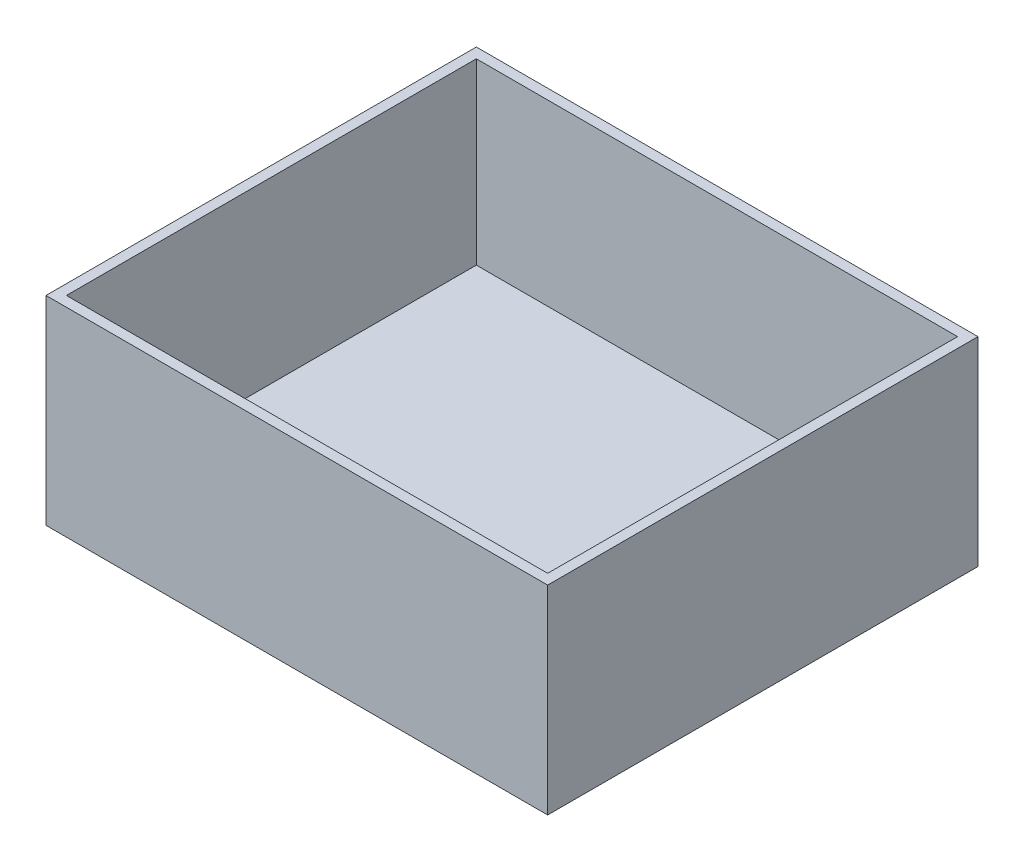
ISO-10303-21;
HEADER;
FILE_DESCRIPTION(('STEP AP214'),'2;1');
FILE_NAME('part.step','',(''),(''),'','','');
FILE_SCHEMA(('AUTOMOTIVE_DESIGN { 1 0 10303 214 1 1 1 1 }'));
ENDSEC;
DATA;
#1=APPLICATION_CONTEXT('core data for automotive mechanical design processes');
#2=APPLICATION_PROTOCOL_DEFINITION('international standard','automotive_design',2000,#1);
#3=PRODUCT_CONTEXT('',#1,'mechanical');
#4=PRODUCT('Part','Part','',(#3));
#5=PRODUCT_RELATED_PRODUCT_CATEGORY('part','',(#4));
#6=PRODUCT_DEFINITION_FORMATION('','',#4);
#7=PRODUCT_DEFINITION_CONTEXT('part definition',#1,'design');
#8=PRODUCT_DEFINITION('design','',#6,#7);
#9=PRODUCT_DEFINITION_SHAPE('','',#8);
#10=(LENGTH_UNIT() NAMED_UNIT(*) SI_UNIT(.MILLI.,.METRE.));
#11=(NAMED_UNIT(*) PLANE_ANGLE_UNIT() SI_UNIT($,.RADIAN.));
#12=(NAMED_UNIT(*) SI_UNIT($,.STERADIAN.) SOLID_ANGLE_UNIT());
#13=UNCERTAINTY_MEASURE_WITH_UNIT(LENGTH_MEASURE(1.E-05),#10,'distance_accuracy_value','');
#14=(GEOMETRIC_REPRESENTATION_CONTEXT(3) GLOBAL_UNCERTAINTY_ASSIGNED_CONTEXT((#13)) GLOBAL_UNIT_ASSIGNED_CONTEXT((#10,
#11,#12)) REPRESENTATION_CONTEXT('',''));
#15=CARTESIAN_POINT('',(0.,0.,0.));
#16=DIRECTION('',(0.,0.,1.));
#17=DIRECTION('',(1.,0.,0.));
#18=AXIS2_PLACEMENT_3D('',#15,#16,#17);
#19=CARTESIAN_POINT('',(49.13,39.,-42.145));
#20=DIRECTION('',(-1.,0.,0.));
#21=DIRECTION('',(0.,0.,1.));
#22=AXIS2_PLACEMENT_3D('',#19,#20,#21);
#23=PLANE('',#22);
#24=DIRECTION('',(0.,0.,-1.));
#25=VECTOR('',#24,1.);
#26=CARTESIAN_POINT('',(49.13,0.,-42.145));
#27=LINE('',#26,#25);
#28=CARTESIAN_POINT('',(49.13,0.,42.145));
#29=VERTEX_POINT('',#28);
#30=CARTESIAN_POINT('',(49.13,0.,-42.145));
#31=VERTEX_POINT('',#30);
#32=EDGE_CURVE('E147',#29,#31,#27,.T.);
#33=ORIENTED_EDGE('',*,*,#32,.T.);
#34=DIRECTION('',(0.,-1.,0.));
#35=VECTOR('',#34,1.);
#36=CARTESIAN_POINT('',(49.13,39.,-42.145));
#37=LINE('',#36,#35);
#38=CARTESIAN_POINT('',(49.13,39.,-42.145));
#39=VERTEX_POINT('',#38);
#40=EDGE_CURVE('E11',#39,#31,#37,.T.);
#41=ORIENTED_EDGE('',*,*,#40,.F.);
#42=DIRECTION('',(0.,0.,-1.));
#43=VECTOR('',#42,1.);
#44=CARTESIAN_POINT('',(49.13,39.,-42.145));
#45=LINE('',#44,#43);
#46=CARTESIAN_POINT('',(49.13,39.,42.145));
#47=VERTEX_POINT('',#46);
#48=EDGE_CURVE('E151',#47,#39,#45,.T.);
#49=ORIENTED_EDGE('',*,*,#48,.F.);
#50=DIRECTION('',(0.,-1.,0.));
#51=VECTOR('',#50,1.);
#52=CARTESIAN_POINT('',(49.13,39.,42.145));
#53=LINE('',#52,#51);
#54=EDGE_CURVE('E157',#47,#29,#53,.T.);
#55=ORIENTED_EDGE('',*,*,#54,.T.);
#56=EDGE_LOOP('',(#33,#41,#49,#55));
#57=FACE_BOUND('',#56,.T.);
#58=ADVANCED_FACE('F39',(#57),#23,.F.);
#59=CARTESIAN_POINT('',(-49.13,39.,-42.145));
#60=DIRECTION('',(0.,0.,1.));
#61=DIRECTION('',(1.,0.,0.));
#62=AXIS2_PLACEMENT_3D('',#59,#60,#61);
#63=PLANE('',#62);
#64=DIRECTION('',(-1.,0.,0.));
#65=VECTOR('',#64,1.);
#66=CARTESIAN_POINT('',(-49.13,0.,-42.145));
#67=LINE('',#66,#65);
#68=CARTESIAN_POINT('',(-49.13,0.,-42.145));
#69=VERTEX_POINT('',#68);
#70=EDGE_CURVE('E160',#31,#69,#67,.T.);
#71=ORIENTED_EDGE('',*,*,#70,.T.);
#72=DIRECTION('',(0.,-1.,0.));
#73=VECTOR('',#72,1.);
#74=CARTESIAN_POINT('',(-49.13,39.,-42.145));
#75=LINE('',#74,#73);
#76=CARTESIAN_POINT('',(-49.13,39.,-42.145));
#77=VERTEX_POINT('',#76);
#78=EDGE_CURVE('E46',#77,#69,#75,.T.);
#79=ORIENTED_EDGE('',*,*,#78,.F.);
#80=DIRECTION('',(-1.,0.,0.));
#81=VECTOR('',#80,1.);
#82=CARTESIAN_POINT('',(-49.13,39.,-42.145));
#83=LINE('',#82,#81);
#84=EDGE_CURVE('E90',#39,#77,#83,.T.);
#85=ORIENTED_EDGE('',*,*,#84,.F.);
#86=ORIENTED_EDGE('',*,*,#40,.T.);
#87=EDGE_LOOP('',(#71,#79,#85,#86));
#88=FACE_BOUND('',#87,.T.);
#89=ADVANCED_FACE('F189',(#88),#63,.F.);
#90=CARTESIAN_POINT('',(-49.13,39.,-42.145));
#91=DIRECTION('',(1.,0.,0.));
#92=DIRECTION('',(0.,0.,-1.));
#93=AXIS2_PLACEMENT_3D('',#90,#91,#92);
#94=PLANE('',#93);
#95=DIRECTION('',(0.,0.,1.));
#96=VECTOR('',#95,1.);
#97=CARTESIAN_POINT('',(-49.13,0.,-42.145));
#98=LINE('',#97,#96);
#99=CARTESIAN_POINT('',(-49.13,0.,42.145));
#100=VERTEX_POINT('',#99);
#101=EDGE_CURVE('E162',#69,#100,#98,.T.);
#102=ORIENTED_EDGE('',*,*,#101,.T.);
#103=DIRECTION('',(0.,-1.,0.));
#104=VECTOR('',#103,1.);
#105=CARTESIAN_POINT('',(-49.13,39.,42.145));
#106=LINE('',#105,#104);
#107=CARTESIAN_POINT('',(-49.13,39.,42.145));
#108=VERTEX_POINT('',#107);
#109=EDGE_CURVE('E166',#108,#100,#106,.T.);
#110=ORIENTED_EDGE('',*,*,#109,.F.);
#111=DIRECTION('',(0.,0.,1.));
#112=VECTOR('',#111,1.);
#113=CARTESIAN_POINT('',(-49.13,39.,-42.145));
#114=LINE('',#113,#112);
#115=EDGE_CURVE('E154',#77,#108,#114,.T.);
#116=ORIENTED_EDGE('',*,*,#115,.F.);
#117=ORIENTED_EDGE('',*,*,#78,.T.);
#118=EDGE_LOOP('',(#102,#110,#116,#117));
#119=FACE_BOUND('',#118,.T.);
#120=ADVANCED_FACE('F171',(#119),#94,.F.);
#121=CARTESIAN_POINT('',(-49.13,39.,42.145));
#122=DIRECTION('',(0.,0.,-1.));
#123=DIRECTION('',(-1.,0.,0.));
#124=AXIS2_PLACEMENT_3D('',#121,#122,#123);
#125=PLANE('',#124);
#126=DIRECTION('',(1.,0.,0.));
#127=VECTOR('',#126,1.);
#128=CARTESIAN_POINT('',(-49.13,0.,42.145));
#129=LINE('',#128,#127);
#130=EDGE_CURVE('E83',#100,#29,#129,.T.);
#131=ORIENTED_EDGE('',*,*,#130,.T.);
#132=ORIENTED_EDGE('',*,*,#54,.F.);
#133=DIRECTION('',(1.,0.,0.));
#134=VECTOR('',#133,1.);
#135=CARTESIAN_POINT('',(-49.13,39.,42.145));
#136=LINE('',#135,#134);
#137=EDGE_CURVE('E62',#108,#47,#136,.T.);
#138=ORIENTED_EDGE('',*,*,#137,.F.);
#139=ORIENTED_EDGE('',*,*,#109,.T.);
#140=EDGE_LOOP('',(#131,#132,#138,#139));
#141=FACE_BOUND('',#140,.T.);
#142=ADVANCED_FACE('F179',(#141),#125,.F.);
#143=CARTESIAN_POINT('',(0.,39.,0.));
#144=DIRECTION('',(0.,1.,0.));
#145=DIRECTION('',(0.,0.,1.));
#146=AXIS2_PLACEMENT_3D('',#143,#144,#145);
#147=PLANE('',#146);
#148=DIRECTION('',(0.,0.,-1.));
#149=VECTOR('',#148,1.);
#150=CARTESIAN_POINT('',(47.13,39.,-40.145));
#151=LINE('',#150,#149);
#152=CARTESIAN_POINT('',(47.13,39.,40.145));
#153=VERTEX_POINT('',#152);
#154=CARTESIAN_POINT('',(47.13,39.,-40.145));
#155=VERTEX_POINT('',#154);
#156=EDGE_CURVE('E53',#153,#155,#151,.T.);
#157=ORIENTED_EDGE('',*,*,#156,.F.);
#158=DIRECTION('',(1.,0.,0.));
#159=VECTOR('',#158,1.);
#160=CARTESIAN_POINT('',(-47.13,39.,40.145));
#161=LINE('',#160,#159);
#162=CARTESIAN_POINT('',(-47.13,39.,40.145));
#163=VERTEX_POINT('',#162);
#164=EDGE_CURVE('E132',#163,#153,#161,.T.);
#165=ORIENTED_EDGE('',*,*,#164,.F.);
#166=DIRECTION('',(0.,0.,1.));
#167=VECTOR('',#166,1.);
#168=CARTESIAN_POINT('',(-47.13,39.,-40.145));
#169=LINE('',#168,#167);
#170=CARTESIAN_POINT('',(-47.13,39.,-40.145));
#171=VERTEX_POINT('',#170);
#172=EDGE_CURVE('E135',#171,#163,#169,.T.);
#173=ORIENTED_EDGE('',*,*,#172,.F.);
#174=DIRECTION('',(-1.,0.,0.));
#175=VECTOR('',#174,1.);
#176=CARTESIAN_POINT('',(-47.13,39.,-40.145));
#177=LINE('',#176,#175);
#178=EDGE_CURVE('E141',#155,#171,#177,.T.);
#179=ORIENTED_EDGE('',*,*,#178,.F.);
#180=EDGE_LOOP('',(#157,#165,#173,#179));
#181=FACE_BOUND('',#180,.T.);
#182=ORIENTED_EDGE('',*,*,#48,.T.);
#183=ORIENTED_EDGE('',*,*,#84,.T.);
#184=ORIENTED_EDGE('',*,*,#115,.T.);
#185=ORIENTED_EDGE('',*,*,#137,.T.);
#186=EDGE_LOOP('',(#182,#183,#184,#185));
#187=FACE_BOUND('',#186,.T.);
#188=ADVANCED_FACE('F181',(#181,#187),#147,.T.);
#189=CARTESIAN_POINT('',(0.,0.,0.));
#190=DIRECTION('',(0.,1.,0.));
#191=DIRECTION('',(0.,0.,1.));
#192=AXIS2_PLACEMENT_3D('',#189,#190,#191);
#193=PLANE('',#192);
#194=ORIENTED_EDGE('',*,*,#32,.F.);
#195=ORIENTED_EDGE('',*,*,#130,.F.);
#196=ORIENTED_EDGE('',*,*,#101,.F.);
#197=ORIENTED_EDGE('',*,*,#70,.F.);
#198=EDGE_LOOP('',(#194,#195,#196,#197));
#199=FACE_BOUND('',#198,.T.);
#200=ADVANCED_FACE('F175',(#199),#193,.F.);
#201=CARTESIAN_POINT('',(47.13,4.,-40.145));
#202=DIRECTION('',(1.,0.,0.));
#203=DIRECTION('',(0.,0.,-1.));
#204=AXIS2_PLACEMENT_3D('',#201,#202,#203);
#205=PLANE('',#204);
#206=ORIENTED_EDGE('',*,*,#156,.T.);
#207=DIRECTION('',(0.,1.,0.));
#208=VECTOR('',#207,1.);
#209=CARTESIAN_POINT('',(47.13,4.,-40.145));
#210=LINE('',#209,#208);
#211=CARTESIAN_POINT('',(47.13,4.,-40.145));
#212=VERTEX_POINT('',#211);
#213=EDGE_CURVE('E110',#212,#155,#210,.T.);
#214=ORIENTED_EDGE('',*,*,#213,.F.);
#215=DIRECTION('',(0.,0.,-1.));
#216=VECTOR('',#215,1.);
#217=CARTESIAN_POINT('',(47.13,4.,-40.145));
#218=LINE('',#217,#216);
#219=CARTESIAN_POINT('',(47.13,4.,40.145));
#220=VERTEX_POINT('',#219);
#221=EDGE_CURVE('E114',#220,#212,#218,.T.);
#222=ORIENTED_EDGE('',*,*,#221,.F.);
#223=DIRECTION('',(0.,1.,0.));
#224=VECTOR('',#223,1.);
#225=CARTESIAN_POINT('',(47.13,4.,40.145));
#226=LINE('',#225,#224);
#227=EDGE_CURVE('E145',#220,#153,#226,.T.);
#228=ORIENTED_EDGE('',*,*,#227,.T.);
#229=EDGE_LOOP('',(#206,#214,#222,#228));
#230=FACE_BOUND('',#229,.T.);
#231=ADVANCED_FACE('F112',(#230),#205,.F.);
#232=CARTESIAN_POINT('',(-47.13,4.,40.145));
#233=DIRECTION('',(0.,0.,1.));
#234=DIRECTION('',(1.,0.,0.));
#235=AXIS2_PLACEMENT_3D('',#232,#233,#234);
#236=PLANE('',#235);
#237=ORIENTED_EDGE('',*,*,#164,.T.);
#238=ORIENTED_EDGE('',*,*,#227,.F.);
#239=DIRECTION('',(1.,0.,0.));
#240=VECTOR('',#239,1.);
#241=CARTESIAN_POINT('',(-47.13,4.,40.145));
#242=LINE('',#241,#240);
#243=CARTESIAN_POINT('',(-47.13,4.,40.145));
#244=VERTEX_POINT('',#243);
#245=EDGE_CURVE('E120',#244,#220,#242,.T.);
#246=ORIENTED_EDGE('',*,*,#245,.F.);
#247=DIRECTION('',(0.,1.,0.));
#248=VECTOR('',#247,1.);
#249=CARTESIAN_POINT('',(-47.13,4.,40.145));
#250=LINE('',#249,#248);
#251=EDGE_CURVE('E148',#244,#163,#250,.T.);
#252=ORIENTED_EDGE('',*,*,#251,.T.);
#253=EDGE_LOOP('',(#237,#238,#246,#252));
#254=FACE_BOUND('',#253,.T.);
#255=ADVANCED_FACE('F232',(#254),#236,.F.);
#256=CARTESIAN_POINT('',(-47.13,4.,-40.145));
#257=DIRECTION('',(-1.,0.,0.));
#258=DIRECTION('',(0.,0.,1.));
#259=AXIS2_PLACEMENT_3D('',#256,#257,#258);
#260=PLANE('',#259);
#261=ORIENTED_EDGE('',*,*,#172,.T.);
#262=ORIENTED_EDGE('',*,*,#251,.F.);
#263=DIRECTION('',(0.,0.,1.));
#264=VECTOR('',#263,1.);
#265=CARTESIAN_POINT('',(-47.13,4.,-40.145));
#266=LINE('',#265,#264);
#267=CARTESIAN_POINT('',(-47.13,4.,-40.145));
#268=VERTEX_POINT('',#267);
#269=EDGE_CURVE('E128',#268,#244,#266,.T.);
#270=ORIENTED_EDGE('',*,*,#269,.F.);
#271=DIRECTION('',(0.,1.,0.));
#272=VECTOR('',#271,1.);
#273=CARTESIAN_POINT('',(-47.13,4.,-40.145));
#274=LINE('',#273,#272);
#275=EDGE_CURVE('E119',#268,#171,#274,.T.);
#276=ORIENTED_EDGE('',*,*,#275,.T.);
#277=EDGE_LOOP('',(#261,#262,#270,#276));
#278=FACE_BOUND('',#277,.T.);
#279=ADVANCED_FACE('F242',(#278),#260,.F.);
#280=CARTESIAN_POINT('',(-47.13,4.,-40.145));
#281=DIRECTION('',(0.,0.,-1.));
#282=DIRECTION('',(-1.,0.,0.));
#283=AXIS2_PLACEMENT_3D('',#280,#281,#282);
#284=PLANE('',#283);
#285=ORIENTED_EDGE('',*,*,#178,.T.);
#286=ORIENTED_EDGE('',*,*,#275,.F.);
#287=DIRECTION('',(-1.,0.,0.));
#288=VECTOR('',#287,1.);
#289=CARTESIAN_POINT('',(-47.13,4.,-40.145));
#290=LINE('',#289,#288);
#291=EDGE_CURVE('E123',#212,#268,#290,.T.);
#292=ORIENTED_EDGE('',*,*,#291,.F.);
#293=ORIENTED_EDGE('',*,*,#213,.T.);
#294=EDGE_LOOP('',(#285,#286,#292,#293));
#295=FACE_BOUND('',#294,.T.);
#296=ADVANCED_FACE('F124',(#295),#284,.F.);
#297=CARTESIAN_POINT('',(0.,4.,0.));
#298=DIRECTION('',(0.,1.,0.));
#299=DIRECTION('',(0.,0.,1.));
#300=AXIS2_PLACEMENT_3D('',#297,#298,#299);
#301=PLANE('',#300);
#302=ORIENTED_EDGE('',*,*,#221,.T.);
#303=ORIENTED_EDGE('',*,*,#291,.T.);
#304=ORIENTED_EDGE('',*,*,#269,.T.);
#305=ORIENTED_EDGE('',*,*,#245,.T.);
#306=EDGE_LOOP('',(#302,#303,#304,#305));
#307=FACE_BOUND('',#306,.T.);
#308=ADVANCED_FACE('F130',(#307),#301,.T.);
#309=CLOSED_SHELL('',(#58,#89,#120,#142,#188,#200,#231,#255,#279,#296,#308));
#310=MANIFOLD_SOLID_BREP('B2',#309);
#311=ADVANCED_BREP_SHAPE_REPRESENTATION('',(#18,#310),#14);
#312=SHAPE_DEFINITION_REPRESENTATION(#9,#311);
ENDSEC;
END-ISO-10303-21;
